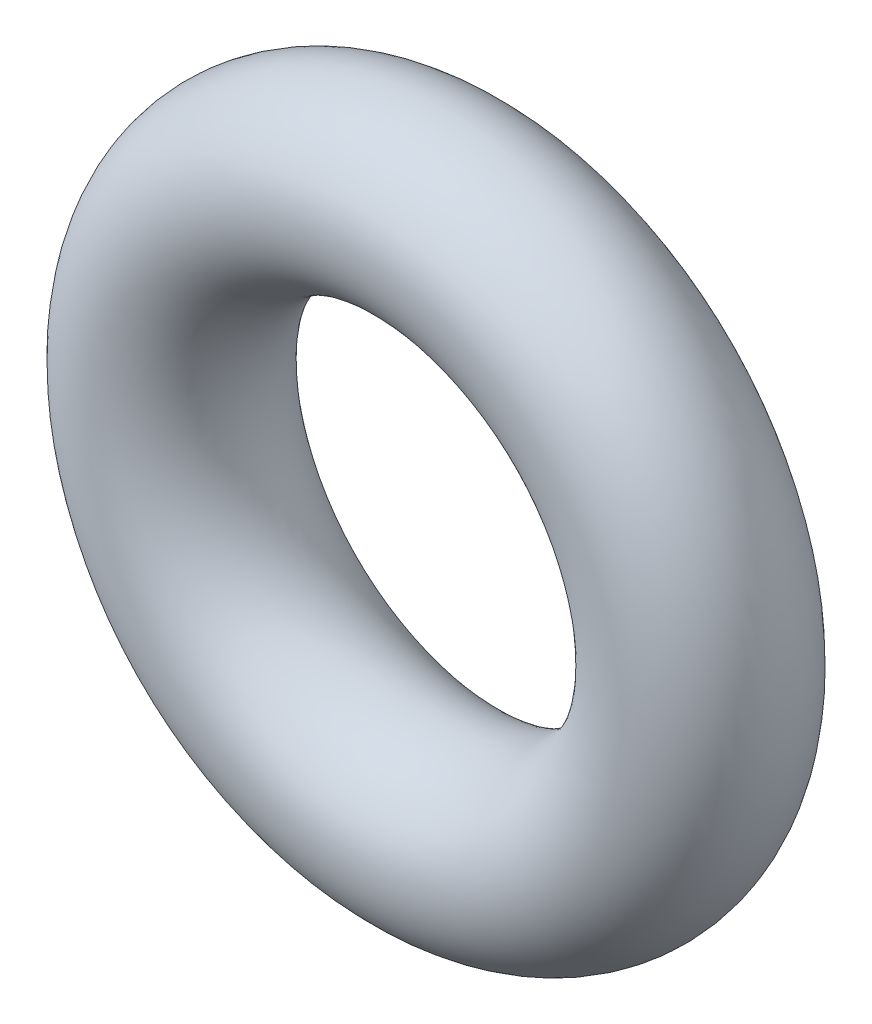
ISO-10303-21;
HEADER;
FILE_DESCRIPTION(('STEP AP214'),'2;1');
FILE_NAME('part.step','',(''),(''),'','','');
FILE_SCHEMA(('AUTOMOTIVE_DESIGN { 1 0 10303 214 1 1 1 1 }'));
ENDSEC;
DATA;
#1=APPLICATION_CONTEXT('core data for automotive mechanical design processes');
#2=APPLICATION_PROTOCOL_DEFINITION('international standard','automotive_design',2000,#1);
#3=PRODUCT_CONTEXT('',#1,'mechanical');
#4=PRODUCT('Part','Part','',(#3));
#5=PRODUCT_RELATED_PRODUCT_CATEGORY('part','',(#4));
#6=PRODUCT_DEFINITION_FORMATION('','',#4);
#7=PRODUCT_DEFINITION_CONTEXT('part definition',#1,'design');
#8=PRODUCT_DEFINITION('design','',#6,#7);
#9=PRODUCT_DEFINITION_SHAPE('','',#8);
#10=(LENGTH_UNIT() NAMED_UNIT(*) SI_UNIT(.MILLI.,.METRE.));
#11=(NAMED_UNIT(*) PLANE_ANGLE_UNIT() SI_UNIT($,.RADIAN.));
#12=(NAMED_UNIT(*) SI_UNIT($,.STERADIAN.) SOLID_ANGLE_UNIT());
#13=UNCERTAINTY_MEASURE_WITH_UNIT(LENGTH_MEASURE(1.E-05),#10,'distance_accuracy_value','');
#14=(GEOMETRIC_REPRESENTATION_CONTEXT(3) GLOBAL_UNCERTAINTY_ASSIGNED_CONTEXT((#13)) GLOBAL_UNIT_ASSIGNED_CONTEXT((#10,
#11,#12)) REPRESENTATION_CONTEXT('',''));
#15=CARTESIAN_POINT('',(0.,0.,0.));
#16=DIRECTION('',(0.,0.,1.));
#17=DIRECTION('',(1.,0.,0.));
#18=AXIS2_PLACEMENT_3D('',#15,#16,#17);
#19=CARTESIAN_POINT('',(0.,0.,0.));
#20=DIRECTION('',(0.,0.,-1.));
#21=DIRECTION('',(-1.,0.,0.));
#22=AXIS2_PLACEMENT_3D('',#19,#20,#21);
#23=TOROIDAL_SURFACE('',#22,7.5,2.49999999999999);
#24=CARTESIAN_POINT('',(-9.99999999999999,0.,0.));
#25=VERTEX_POINT('',#24);
#26=VERTEX_LOOP('',#25);
#27=FACE_BOUND('',#26,.T.);
#28=ADVANCED_FACE('F29',(#27),#23,.T.);
#29=CLOSED_SHELL('',(#28));
#30=MANIFOLD_SOLID_BREP('B2',#29);
#31=ADVANCED_BREP_SHAPE_REPRESENTATION('',(#18,#30),#14);
#32=SHAPE_DEFINITION_REPRESENTATION(#9,#31);
ENDSEC;
END-ISO-10303-21;
